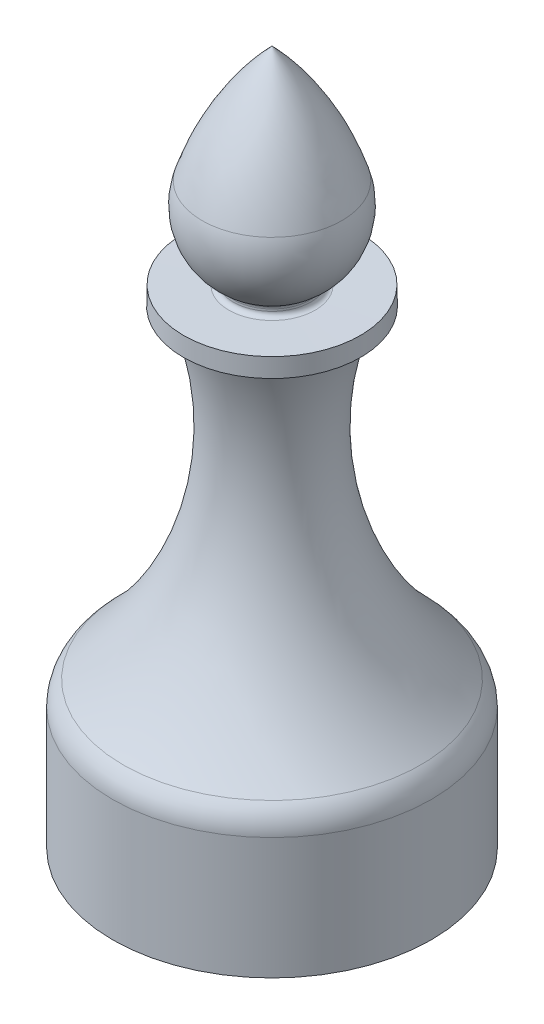
ISO-10303-21;
HEADER;
FILE_DESCRIPTION(('STEP AP214'),'2;1');
FILE_NAME('part.step','',(''),(''),'','','');
FILE_SCHEMA(('AUTOMOTIVE_DESIGN { 1 0 10303 214 1 1 1 1 }'));
ENDSEC;
DATA;
#1=APPLICATION_CONTEXT('core data for automotive mechanical design processes');
#2=APPLICATION_PROTOCOL_DEFINITION('international standard','automotive_design',2000,#1);
#3=PRODUCT_CONTEXT('',#1,'mechanical');
#4=PRODUCT('Part','Part','',(#3));
#5=PRODUCT_RELATED_PRODUCT_CATEGORY('part','',(#4));
#6=PRODUCT_DEFINITION_FORMATION('','',#4);
#7=PRODUCT_DEFINITION_CONTEXT('part definition',#1,'design');
#8=PRODUCT_DEFINITION('design','',#6,#7);
#9=PRODUCT_DEFINITION_SHAPE('','',#8);
#10=(LENGTH_UNIT() NAMED_UNIT(*) SI_UNIT(.MILLI.,.METRE.));
#11=(NAMED_UNIT(*) PLANE_ANGLE_UNIT() SI_UNIT($,.RADIAN.));
#12=(NAMED_UNIT(*) SI_UNIT($,.STERADIAN.) SOLID_ANGLE_UNIT());
#13=UNCERTAINTY_MEASURE_WITH_UNIT(LENGTH_MEASURE(1.E-05),#10,'distance_accuracy_value','');
#14=(GEOMETRIC_REPRESENTATION_CONTEXT(3) GLOBAL_UNCERTAINTY_ASSIGNED_CONTEXT((#13)) GLOBAL_UNIT_ASSIGNED_CONTEXT((#10,
#11,#12)) REPRESENTATION_CONTEXT('',''));
#15=CARTESIAN_POINT('',(0.,0.,0.));
#16=DIRECTION('',(0.,0.,1.));
#17=DIRECTION('',(1.,0.,0.));
#18=AXIS2_PLACEMENT_3D('',#15,#16,#17);
#19=CARTESIAN_POINT('',(0.,48.928577878286,0.));
#20=DIRECTION('',(0.,1.,0.));
#21=DIRECTION('',(0.,0.,1.));
#22=AXIS2_PLACEMENT_3D('',#19,#20,#21);
#23=DEGENERATE_TOROIDAL_SURFACE('',#22,0.276456473879776,6.15140970477283,.T.);
#24=CARTESIAN_POINT('',(0.,50.7842064246336,0.));
#25=DIRECTION('',(0.,1.,0.));
#26=DIRECTION('',(0.,0.,1.));
#27=AXIS2_PLACEMENT_3D('',#24,#25,#26);
#28=CIRCLE('',#27,6.14130805375401);
#29=CARTESIAN_POINT('',(0.,50.7842064246336,6.14130805375401));
#30=VERTEX_POINT('',#29);
#31=EDGE_CURVE('E55',#30,#30,#28,.T.);
#32=ORIENTED_EDGE('',*,*,#31,.F.);
#33=EDGE_LOOP('',(#32));
#34=FACE_BOUND('',#33,.T.);
#35=CARTESIAN_POINT('',(0.,43.7094983739715,0.));
#36=DIRECTION('',(0.,1.,0.));
#37=DIRECTION('',(0.,0.,1.));
#38=AXIS2_PLACEMENT_3D('',#35,#36,#37);
#39=CIRCLE('',#38,3.53238191584211);
#40=CARTESIAN_POINT('',(0.,43.7094983739715,3.53238191584211));
#41=VERTEX_POINT('',#40);
#42=EDGE_CURVE('E90',#41,#41,#39,.T.);
#43=ORIENTED_EDGE('',*,*,#42,.T.);
#44=EDGE_LOOP('',(#43));
#45=FACE_BOUND('',#44,.T.);
#46=ADVANCED_FACE('F34',(#34,#45),#23,.T.);
#47=CARTESIAN_POINT('',(0.,43.0577546199596,-18.2787156426138));
#48=DIRECTION('',(-1.,0.,0.));
#49=DIRECTION('',(0.,0.,1.));
#50=AXIS2_PLACEMENT_3D('',#47,#48,#49);
#51=CIRCLE('',#50,25.6131922028691);
#52=TRIMMED_CURVE('',#51,(PARAMETER_VALUE(-0.776109050815132)),
(PARAMETER_VALUE(0.776109050815132)),.T.,.PARAMETER.);
#53=CARTESIAN_POINT('',(0.,43.0577546199596,0.));
#54=DIRECTION('',(0.,1.,0.));
#55=AXIS1_PLACEMENT('',#53,#54);
#56=SURFACE_OF_REVOLUTION('',#52,#55);
#57=CARTESIAN_POINT('',(0.,61.,0.));
#58=VERTEX_POINT('',#57);
#59=VERTEX_LOOP('',#58);
#60=FACE_BOUND('',#59,.T.);
#61=ORIENTED_EDGE('',*,*,#31,.T.);
#62=EDGE_LOOP('',(#61));
#63=FACE_BOUND('',#62,.T.);
#64=ADVANCED_FACE('F48',(#60,#63),#56,.T.);
#65=CARTESIAN_POINT('',(0.,27.143900008445,0.));
#66=DIRECTION('',(0.,-1.,0.));
#67=DIRECTION('',(0.,0.,-1.));
#68=AXIS2_PLACEMENT_3D('',#65,#66,#67);
#69=CONICAL_SURFACE('',#68,0.,0.610865238198017);
#70=CARTESIAN_POINT('',(0.,14.8678821817552,0.));
#71=DIRECTION('',(0.,1.,0.));
#72=DIRECTION('',(0.,0.,1.));
#73=AXIS2_PLACEMENT_3D('',#70,#71,#72);
#74=CIRCLE('',#73,8.59576022144496);
#75=CARTESIAN_POINT('',(0.,14.8678821817552,8.59576022144496));
#76=VERTEX_POINT('',#75);
#77=EDGE_CURVE('E57',#76,#76,#74,.T.);
#78=ORIENTED_EDGE('',*,*,#77,.F.);
#79=EDGE_LOOP('',(#78));
#80=FACE_BOUND('',#79,.T.);
#81=CARTESIAN_POINT('',(0.,27.143900008445,0.));
#82=VERTEX_POINT('',#81);
#83=VERTEX_LOOP('',#82);
#84=FACE_BOUND('',#83,.T.);
#85=ADVANCED_FACE('F51',(#80,#84),#69,.F.);
#86=CARTESIAN_POINT('',(0.,12.,0.));
#87=DIRECTION('',(0.,1.,0.));
#88=DIRECTION('',(0.,0.,1.));
#89=AXIS2_PLACEMENT_3D('',#86,#87,#88);
#90=DEGENERATE_TOROIDAL_SURFACE('',#89,4.5,5.,.T.);
#91=CARTESIAN_POINT('',(0.,12.,0.));
#92=DIRECTION('',(0.,1.,0.));
#93=DIRECTION('',(0.,0.,1.));
#94=AXIS2_PLACEMENT_3D('',#91,#92,#93);
#95=CIRCLE('',#94,9.5);
#96=CARTESIAN_POINT('',(0.,12.,9.5));
#97=VERTEX_POINT('',#96);
#98=EDGE_CURVE('E61',#97,#97,#95,.T.);
#99=ORIENTED_EDGE('',*,*,#98,.F.);
#100=EDGE_LOOP('',(#99));
#101=FACE_BOUND('',#100,.T.);
#102=ORIENTED_EDGE('',*,*,#77,.T.);
#103=EDGE_LOOP('',(#102));
#104=FACE_BOUND('',#103,.T.);
#105=ADVANCED_FACE('F148',(#101,#104),#90,.F.);
#106=CARTESIAN_POINT('',(0.,61.,0.));
#107=DIRECTION('',(0.,1.,0.));
#108=DIRECTION('',(0.,0.,1.));
#109=AXIS2_PLACEMENT_3D('',#106,#107,#108);
#110=CYLINDRICAL_SURFACE('',#109,9.50000000000001);
#111=CARTESIAN_POINT('',(0.,0.,0.));
#112=DIRECTION('',(0.,1.,0.));
#113=DIRECTION('',(0.,0.,1.));
#114=AXIS2_PLACEMENT_3D('',#111,#112,#113);
#115=CIRCLE('',#114,9.50000000000001);
#116=CARTESIAN_POINT('',(0.,0.,9.50000000000001));
#117=VERTEX_POINT('',#116);
#118=EDGE_CURVE('E66',#117,#117,#115,.T.);
#119=ORIENTED_EDGE('',*,*,#118,.F.);
#120=EDGE_LOOP('',(#119));
#121=FACE_BOUND('',#120,.T.);
#122=ORIENTED_EDGE('',*,*,#98,.T.);
#123=EDGE_LOOP('',(#122));
#124=FACE_BOUND('',#123,.T.);
#125=ADVANCED_FACE('F152',(#121,#124),#110,.F.);
#126=CARTESIAN_POINT('',(0.,0.,0.));
#127=DIRECTION('',(0.,1.,0.));
#128=DIRECTION('',(0.,0.,1.));
#129=AXIS2_PLACEMENT_3D('',#126,#127,#128);
#130=PLANE('',#129);
#131=CARTESIAN_POINT('',(0.,0.,0.));
#132=DIRECTION('',(0.,1.,0.));
#133=DIRECTION('',(0.,0.,1.));
#134=AXIS2_PLACEMENT_3D('',#131,#132,#133);
#135=CIRCLE('',#134,14.);
#136=CARTESIAN_POINT('',(0.,0.,14.));
#137=VERTEX_POINT('',#136);
#138=EDGE_CURVE('E69',#137,#137,#135,.T.);
#139=ORIENTED_EDGE('',*,*,#138,.F.);
#140=EDGE_LOOP('',(#139));
#141=FACE_BOUND('',#140,.T.);
#142=ORIENTED_EDGE('',*,*,#118,.T.);
#143=EDGE_LOOP('',(#142));
#144=FACE_BOUND('',#143,.T.);
#145=ADVANCED_FACE('F139',(#141,#144),#130,.F.);
#146=CARTESIAN_POINT('',(0.,61.,0.));
#147=DIRECTION('',(0.,1.,0.));
#148=DIRECTION('',(0.,0.,1.));
#149=AXIS2_PLACEMENT_3D('',#146,#147,#148);
#150=CYLINDRICAL_SURFACE('',#149,14.);
#151=CARTESIAN_POINT('',(0.,10.6771259699997,0.));
#152=DIRECTION('',(0.,-1.,0.));
#153=DIRECTION('',(0.,0.,-1.));
#154=AXIS2_PLACEMENT_3D('',#151,#152,#153);
#155=CIRCLE('',#154,14.);
#156=CARTESIAN_POINT('',(0.,10.6771259699997,-14.));
#157=VERTEX_POINT('',#156);
#158=EDGE_CURVE('E11',#157,#157,#155,.T.);
#159=ORIENTED_EDGE('',*,*,#158,.T.);
#160=EDGE_LOOP('',(#159));
#161=FACE_BOUND('',#160,.T.);
#162=ORIENTED_EDGE('',*,*,#138,.T.);
#163=EDGE_LOOP('',(#162));
#164=FACE_BOUND('',#163,.T.);
#165=ADVANCED_FACE('F133',(#161,#164),#150,.T.);
#166=CARTESIAN_POINT('',(0.,32.1097472152808,0.));
#167=DIRECTION('',(0.,1.,0.));
#168=DIRECTION('',(0.,0.,1.));
#169=AXIS2_PLACEMENT_3D('',#166,#167,#168);
#170=TOROIDAL_SURFACE('',#169,31.496610992376,26.6558310559065);
#171=CARTESIAN_POINT('',(0.,12.8452615927927,0.));
#172=DIRECTION('',(0.,1.,0.));
#173=DIRECTION('',(0.,0.,1.));
#174=AXIS2_PLACEMENT_3D('',#171,#172,#173);
#175=CIRCLE('',#174,13.073448316495);
#176=CARTESIAN_POINT('',(0.,12.8452615927927,13.073448316495));
#177=VERTEX_POINT('',#176);
#178=EDGE_CURVE('E42',#177,#177,#175,.T.);
#179=ORIENTED_EDGE('',*,*,#178,.T.);
#180=EDGE_LOOP('',(#179));
#181=FACE_BOUND('',#180,.T.);
#182=CARTESIAN_POINT('',(0.,40.3452933999791,0.));
#183=DIRECTION('',(0.,1.,0.));
#184=DIRECTION('',(0.,0.,1.));
#185=AXIS2_PLACEMENT_3D('',#182,#183,#184);
#186=CIRCLE('',#185,6.14490279902685);
#187=CARTESIAN_POINT('',(0.,40.3452933999791,6.14490279902685));
#188=VERTEX_POINT('',#187);
#189=EDGE_CURVE('E72',#188,#188,#186,.T.);
#190=ORIENTED_EDGE('',*,*,#189,.F.);
#191=EDGE_LOOP('',(#190));
#192=FACE_BOUND('',#191,.T.);
#193=ADVANCED_FACE('F128',(#181,#192),#170,.F.);
#194=CARTESIAN_POINT('',(0.,40.3452933999791,0.));
#195=DIRECTION('',(0.,1.,0.));
#196=DIRECTION('',(0.,0.,1.));
#197=AXIS2_PLACEMENT_3D('',#194,#195,#196);
#198=CONICAL_SURFACE('',#197,6.14490279902685,1.08826678169263);
#199=CARTESIAN_POINT('',(0.,41.2077821302718,0.));
#200=DIRECTION('',(0.,1.,0.));
#201=DIRECTION('',(0.,0.,1.));
#202=AXIS2_PLACEMENT_3D('',#199,#200,#201);
#203=CIRCLE('',#202,7.79140709840666);
#204=CARTESIAN_POINT('',(0.,41.2077821302718,7.79140709840666));
#205=VERTEX_POINT('',#204);
#206=EDGE_CURVE('E75',#205,#205,#203,.T.);
#207=ORIENTED_EDGE('',*,*,#206,.F.);
#208=EDGE_LOOP('',(#207));
#209=FACE_BOUND('',#208,.T.);
#210=ORIENTED_EDGE('',*,*,#189,.T.);
#211=EDGE_LOOP('',(#210));
#212=FACE_BOUND('',#211,.T.);
#213=ADVANCED_FACE('F122',(#209,#212),#198,.T.);
#214=CARTESIAN_POINT('',(0.,41.2077821302718,0.));
#215=DIRECTION('',(0.,-1.,0.));
#216=DIRECTION('',(0.,0.,-1.));
#217=AXIS2_PLACEMENT_3D('',#214,#215,#216);
#218=CONICAL_SURFACE('',#217,7.79140709840666,0.0161953982866223);
#219=CARTESIAN_POINT('',(0.,42.8586304048748,0.));
#220=DIRECTION('',(0.,1.,0.));
#221=DIRECTION('',(0.,0.,1.));
#222=AXIS2_PLACEMENT_3D('',#219,#220,#221);
#223=CIRCLE('',#222,7.76466861529397);
#224=CARTESIAN_POINT('',(0.,42.8586304048748,7.76466861529397));
#225=VERTEX_POINT('',#224);
#226=EDGE_CURVE('E78',#225,#225,#223,.T.);
#227=ORIENTED_EDGE('',*,*,#226,.F.);
#228=EDGE_LOOP('',(#227));
#229=FACE_BOUND('',#228,.T.);
#230=ORIENTED_EDGE('',*,*,#206,.T.);
#231=EDGE_LOOP('',(#230));
#232=FACE_BOUND('',#231,.T.);
#233=ADVANCED_FACE('F116',(#229,#232),#218,.T.);
#234=CARTESIAN_POINT('',(0.,42.8586304048748,0.));
#235=DIRECTION('',(0.,1.,0.));
#236=DIRECTION('',(0.,0.,1.));
#237=AXIS2_PLACEMENT_3D('',#234,#235,#236);
#238=CONICAL_SURFACE('',#237,7.76466861529397,1.55460092850827);
#239=CARTESIAN_POINT('',(0.,42.7942703058202,0.));
#240=DIRECTION('',(0.,1.,0.));
#241=DIRECTION('',(0.,0.,1.));
#242=AXIS2_PLACEMENT_3D('',#239,#240,#241);
#243=CIRCLE('',#242,3.79104161372229);
#244=CARTESIAN_POINT('',(0.,42.7942703058202,3.79104161372229));
#245=VERTEX_POINT('',#244);
#246=EDGE_CURVE('E81',#245,#245,#243,.T.);
#247=ORIENTED_EDGE('',*,*,#246,.F.);
#248=EDGE_LOOP('',(#247));
#249=FACE_BOUND('',#248,.T.);
#250=ORIENTED_EDGE('',*,*,#226,.T.);
#251=EDGE_LOOP('',(#250));
#252=FACE_BOUND('',#251,.T.);
#253=ADVANCED_FACE('F110',(#249,#252),#238,.F.);
#254=CARTESIAN_POINT('',(0.,43.2109148978418,0.));
#255=DIRECTION('',(0.,1.,0.));
#256=DIRECTION('',(0.,0.,1.));
#257=AXIS2_PLACEMENT_3D('',#254,#255,#256);
#258=TOROIDAL_SURFACE('',#257,3.81175236753197,0.417159024095376);
#259=CARTESIAN_POINT('',(0.,43.2105037554598,0.));
#260=DIRECTION('',(0.,1.,0.));
#261=DIRECTION('',(0.,0.,1.));
#262=AXIS2_PLACEMENT_3D('',#259,#260,#261);
#263=CIRCLE('',#262,3.3945935460429);
#264=CARTESIAN_POINT('',(0.,43.2105037554598,3.3945935460429));
#265=VERTEX_POINT('',#264);
#266=EDGE_CURVE('E84',#265,#265,#263,.T.);
#267=ORIENTED_EDGE('',*,*,#266,.F.);
#268=EDGE_LOOP('',(#267));
#269=FACE_BOUND('',#268,.T.);
#270=ORIENTED_EDGE('',*,*,#246,.T.);
#271=EDGE_LOOP('',(#270));
#272=FACE_BOUND('',#271,.T.);
#273=ADVANCED_FACE('F104',(#269,#272),#258,.F.);
#274=CARTESIAN_POINT('',(0.,43.2105037554598,0.));
#275=DIRECTION('',(0.,-1.,0.));
#276=DIRECTION('',(0.,0.,-1.));
#277=AXIS2_PLACEMENT_3D('',#274,#275,#276);
#278=CONICAL_SURFACE('',#277,3.3945935460429,0.0161953982866295);
#279=CARTESIAN_POINT('',(0.,43.3884662779687,0.));
#280=DIRECTION('',(0.,1.,0.));
#281=DIRECTION('',(0.,0.,1.));
#282=AXIS2_PLACEMENT_3D('',#279,#280,#281);
#283=CIRCLE('',#282,3.39171112009498);
#284=CARTESIAN_POINT('',(0.,43.3884662779687,3.39171112009498));
#285=VERTEX_POINT('',#284);
#286=EDGE_CURVE('E87',#285,#285,#283,.T.);
#287=ORIENTED_EDGE('',*,*,#286,.F.);
#288=EDGE_LOOP('',(#287));
#289=FACE_BOUND('',#288,.T.);
#290=ORIENTED_EDGE('',*,*,#266,.T.);
#291=EDGE_LOOP('',(#290));
#292=FACE_BOUND('',#291,.T.);
#293=ADVANCED_FACE('F98',(#289,#292),#278,.T.);
#294=CARTESIAN_POINT('',(0.,43.3952866316111,0.));
#295=DIRECTION('',(0.,1.,0.));
#296=DIRECTION('',(0.,0.,1.));
#297=AXIS2_PLACEMENT_3D('',#294,#295,#296);
#298=TOROIDAL_SURFACE('',#297,3.81280340851298,0.421147518797054);
#299=ORIENTED_EDGE('',*,*,#42,.F.);
#300=EDGE_LOOP('',(#299));
#301=FACE_BOUND('',#300,.T.);
#302=ORIENTED_EDGE('',*,*,#286,.T.);
#303=EDGE_LOOP('',(#302));
#304=FACE_BOUND('',#303,.T.);
#305=ADVANCED_FACE('F95',(#301,#304),#298,.F.);
#306=CARTESIAN_POINT('',(0.,10.6771259699997,0.));
#307=DIRECTION('',(0.,-1.,0.));
#308=DIRECTION('',(0.,0.,-1.));
#309=AXIS2_PLACEMENT_3D('',#306,#307,#308);
#310=TOROIDAL_SURFACE('',#309,11.,3.);
#311=ORIENTED_EDGE('',*,*,#158,.F.);
#312=EDGE_LOOP('',(#311));
#313=FACE_BOUND('',#312,.T.);
#314=ORIENTED_EDGE('',*,*,#178,.F.);
#315=EDGE_LOOP('',(#314));
#316=FACE_BOUND('',#315,.T.);
#317=ADVANCED_FACE('F36',(#313,#316),#310,.T.);
#318=CLOSED_SHELL('',(#46,#64,#85,#105,#125,#145,#165,#193,#213,#233,#253,#273,#293,#305,#317));
#319=MANIFOLD_SOLID_BREP('B2',#318);
#320=ADVANCED_BREP_SHAPE_REPRESENTATION('',(#18,#319),#14);
#321=SHAPE_DEFINITION_REPRESENTATION(#9,#320);
ENDSEC;
END-ISO-10303-21;
